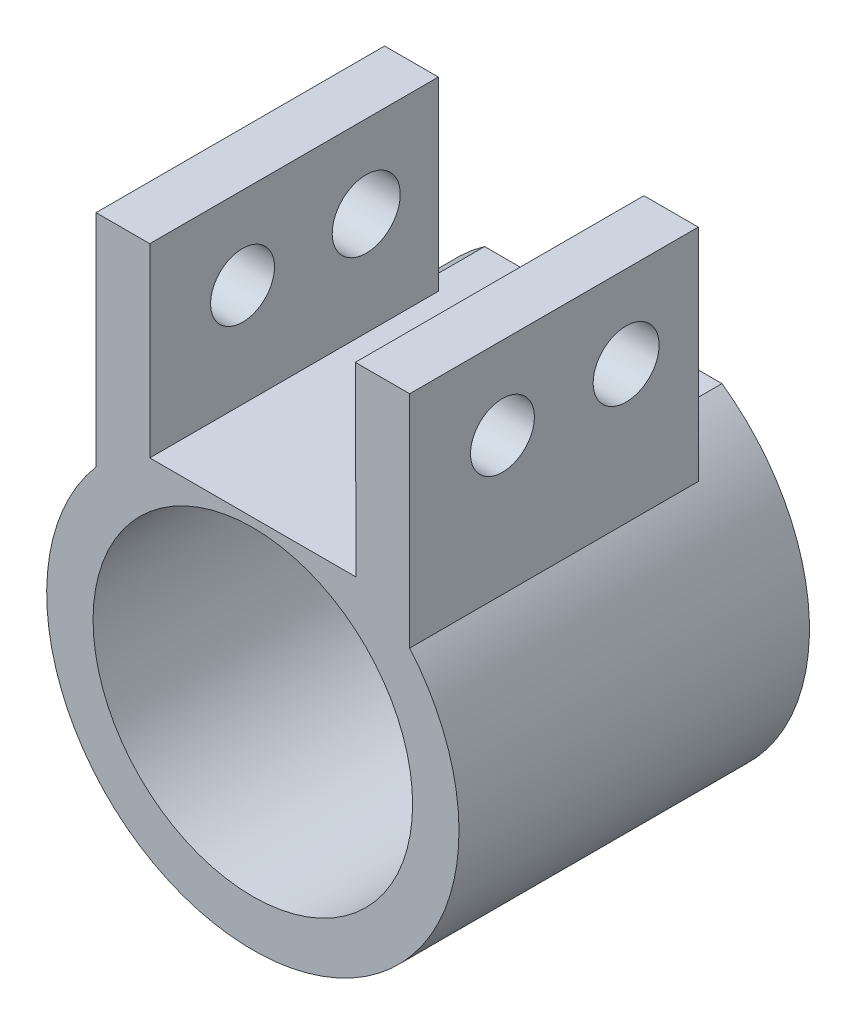
ISO-10303-21;
HEADER;
FILE_DESCRIPTION(('STEP AP214'),'2;1');
FILE_NAME('part.step','',(''),(''),'','','');
FILE_SCHEMA(('AUTOMOTIVE_DESIGN { 1 0 10303 214 1 1 1 1 }'));
ENDSEC;
DATA;
#1=APPLICATION_CONTEXT('core data for automotive mechanical design processes');
#2=APPLICATION_PROTOCOL_DEFINITION('international standard','automotive_design',2000,#1);
#3=PRODUCT_CONTEXT('',#1,'mechanical');
#4=PRODUCT('Part','Part','',(#3));
#5=PRODUCT_RELATED_PRODUCT_CATEGORY('part','',(#4));
#6=PRODUCT_DEFINITION_FORMATION('','',#4);
#7=PRODUCT_DEFINITION_CONTEXT('part definition',#1,'design');
#8=PRODUCT_DEFINITION('design','',#6,#7);
#9=PRODUCT_DEFINITION_SHAPE('','',#8);
#10=(LENGTH_UNIT() NAMED_UNIT(*) SI_UNIT(.MILLI.,.METRE.));
#11=(NAMED_UNIT(*) PLANE_ANGLE_UNIT() SI_UNIT($,.RADIAN.));
#12=(NAMED_UNIT(*) SI_UNIT($,.STERADIAN.) SOLID_ANGLE_UNIT());
#13=UNCERTAINTY_MEASURE_WITH_UNIT(LENGTH_MEASURE(1.E-05),#10,'distance_accuracy_value','');
#14=(GEOMETRIC_REPRESENTATION_CONTEXT(3) GLOBAL_UNCERTAINTY_ASSIGNED_CONTEXT((#13)) GLOBAL_UNIT_ASSIGNED_CONTEXT((#10,
#11,#12)) REPRESENTATION_CONTEXT('',''));
#15=CARTESIAN_POINT('',(0.,0.,0.));
#16=DIRECTION('',(0.,0.,1.));
#17=DIRECTION('',(1.,0.,0.));
#18=AXIS2_PLACEMENT_3D('',#15,#16,#17);
#19=CARTESIAN_POINT('',(0.,12.1763366953853,0.));
#20=DIRECTION('',(0.,1.,0.));
#21=DIRECTION('',(0.,0.,1.));
#22=AXIS2_PLACEMENT_3D('',#19,#20,#21);
#23=PLANE('',#22);
#24=DIRECTION('',(0.,0.,1.));
#25=VECTOR('',#24,1.);
#26=CARTESIAN_POINT('',(4.96946555503048,12.1763366953853,3.));
#27=LINE('',#26,#25);
#28=CARTESIAN_POINT('',(4.96946555503048,12.1763366953853,13.6842719282327));
#29=VERTEX_POINT('',#28);
#30=CARTESIAN_POINT('',(4.96946555503048,12.1763366953853,17.));
#31=VERTEX_POINT('',#30);
#32=EDGE_CURVE('E184',#29,#31,#27,.T.);
#33=ORIENTED_EDGE('',*,*,#32,.F.);
#34=DIRECTION('',(1.,0.,0.));
#35=VECTOR('',#34,1.);
#36=CARTESIAN_POINT('',(-9.39232609008902,12.1763366953853,13.6842719282327));
#37=LINE('',#36,#35);
#38=CARTESIAN_POINT('',(5.,12.1763366953853,13.6842719282327));
#39=VERTEX_POINT('',#38);
#40=EDGE_CURVE('E65',#29,#39,#37,.T.);
#41=ORIENTED_EDGE('',*,*,#40,.T.);
#42=DIRECTION('',(0.,0.,1.));
#43=VECTOR('',#42,1.);
#44=CARTESIAN_POINT('',(5.,12.1763366953853,-2.));
#45=LINE('',#44,#43);
#46=CARTESIAN_POINT('',(5.,12.1763366953853,17.));
#47=VERTEX_POINT('',#46);
#48=EDGE_CURVE('E208',#39,#47,#45,.T.);
#49=ORIENTED_EDGE('',*,*,#48,.T.);
#50=DIRECTION('',(1.,0.,0.));
#51=VECTOR('',#50,1.);
#52=CARTESIAN_POINT('',(4.96946555503048,12.1763366953853,17.));
#53=LINE('',#52,#51);
#54=EDGE_CURVE('E309',#31,#47,#53,.T.);
#55=ORIENTED_EDGE('',*,*,#54,.F.);
#56=EDGE_LOOP('',(#33,#41,#49,#55));
#57=FACE_BOUND('',#56,.T.);
#58=ADVANCED_FACE('F49',(#57),#23,.F.);
#59=DIRECTION('',(-1.,0.,0.));
#60=VECTOR('',#59,1.);
#61=CARTESIAN_POINT('',(19.,12.1763366953853,5.25100040032032));
#62=LINE('',#61,#60);
#63=CARTESIAN_POINT('',(4.96946555503048,12.1763366953853,5.25100040032032));
#64=VERTEX_POINT('',#63);
#65=CARTESIAN_POINT('',(5.,12.1763366953853,5.25100040032032));
#66=VERTEX_POINT('',#65);
#67=EDGE_CURVE('E276',#64,#66,#62,.F.);
#68=ORIENTED_EDGE('',*,*,#67,.F.);
#69=CARTESIAN_POINT('',(4.96946555503048,12.1763366953853,3.));
#70=VERTEX_POINT('',#69);
#71=EDGE_CURVE('E183',#70,#64,#27,.T.);
#72=ORIENTED_EDGE('',*,*,#71,.F.);
#73=DIRECTION('',(-1.,0.,0.));
#74=VECTOR('',#73,1.);
#75=CARTESIAN_POINT('',(4.96946555503048,12.1763366953853,3.));
#76=LINE('',#75,#74);
#77=CARTESIAN_POINT('',(5.,12.1763366953853,3.));
#78=VERTEX_POINT('',#77);
#79=EDGE_CURVE('E186',#78,#70,#76,.T.);
#80=ORIENTED_EDGE('',*,*,#79,.F.);
#81=EDGE_CURVE('E204',#78,#66,#45,.T.);
#82=ORIENTED_EDGE('',*,*,#81,.T.);
#83=EDGE_LOOP('',(#68,#72,#80,#82));
#84=FACE_BOUND('',#83,.T.);
#85=ADVANCED_FACE('F400',(#84),#23,.F.);
#86=CARTESIAN_POINT('',(5.,12.1763366953853,7.74899959967968));
#87=VERTEX_POINT('',#86);
#88=CARTESIAN_POINT('',(5.,12.1763366953853,11.3157280717673));
#89=VERTEX_POINT('',#88);
#90=EDGE_CURVE('E177',#87,#89,#45,.T.);
#91=ORIENTED_EDGE('',*,*,#90,.T.);
#92=DIRECTION('',(1.,0.,0.));
#93=VECTOR('',#92,1.);
#94=CARTESIAN_POINT('',(-9.39232609008902,12.1763366953853,11.3157280717673));
#95=LINE('',#94,#93);
#96=CARTESIAN_POINT('',(4.96946555503048,12.1763366953853,11.3157280717673));
#97=VERTEX_POINT('',#96);
#98=EDGE_CURVE('E164',#89,#97,#95,.F.);
#99=ORIENTED_EDGE('',*,*,#98,.T.);
#100=CARTESIAN_POINT('',(4.96946555503048,12.1763366953853,7.74899959967968));
#101=VERTEX_POINT('',#100);
#102=EDGE_CURVE('E175',#101,#97,#27,.T.);
#103=ORIENTED_EDGE('',*,*,#102,.F.);
#104=DIRECTION('',(-1.,0.,0.));
#105=VECTOR('',#104,1.);
#106=CARTESIAN_POINT('',(19.,12.1763366953853,7.74899959967968));
#107=LINE('',#106,#105);
#108=EDGE_CURVE('E274',#87,#101,#107,.T.);
#109=ORIENTED_EDGE('',*,*,#108,.F.);
#110=EDGE_LOOP('',(#91,#99,#103,#109));
#111=FACE_BOUND('',#110,.T.);
#112=ADVANCED_FACE('F173',(#111),#23,.F.);
#113=CARTESIAN_POINT('',(0.,0.,3.));
#114=DIRECTION('',(0.,0.,-1.));
#115=DIRECTION('',(-1.,0.,0.));
#116=AXIS2_PLACEMENT_3D('',#113,#114,#115);
#117=PLANE('',#116);
#118=CARTESIAN_POINT('',(0.,0.,3.));
#119=DIRECTION('',(0.,0.,-1.));
#120=DIRECTION('',(-1.,0.,0.));
#121=AXIS2_PLACEMENT_3D('',#118,#119,#120);
#122=CIRCLE('',#121,10.);
#123=CARTESIAN_POINT('',(5.75738814426261,8.17633669538531,3.));
#124=VERTEX_POINT('',#123);
#125=CARTESIAN_POINT('',(7.60767390991097,6.49024634975128,3.));
#126=VERTEX_POINT('',#125);
#127=EDGE_CURVE('E264',#124,#126,#122,.T.);
#128=ORIENTED_EDGE('',*,*,#127,.F.);
#129=DIRECTION('',(-1.,0.,0.));
#130=VECTOR('',#129,1.);
#131=CARTESIAN_POINT('',(9.34676632854125,8.17633669538531,3.));
#132=LINE('',#131,#130);
#133=CARTESIAN_POINT('',(5.,8.17633669538531,3.));
#134=VERTEX_POINT('',#133);
#135=EDGE_CURVE('E266',#124,#134,#132,.T.);
#136=ORIENTED_EDGE('',*,*,#135,.T.);
#137=DIRECTION('',(0.,-1.,0.));
#138=VECTOR('',#137,1.);
#139=CARTESIAN_POINT('',(5.00000000000001,0.,3.));
#140=LINE('',#139,#138);
#141=EDGE_CURVE('E233',#78,#134,#140,.T.);
#142=ORIENTED_EDGE('',*,*,#141,.F.);
#143=ORIENTED_EDGE('',*,*,#79,.T.);
#144=DIRECTION('',(0.,-1.,0.));
#145=VECTOR('',#144,1.);
#146=CARTESIAN_POINT('',(4.96946555503048,17.1763366953853,3.));
#147=LINE('',#146,#145);
#148=CARTESIAN_POINT('',(4.96946555503048,17.1763366953853,3.));
#149=VERTEX_POINT('',#148);
#150=EDGE_CURVE('E194',#149,#70,#147,.T.);
#151=ORIENTED_EDGE('',*,*,#150,.F.);
#152=DIRECTION('',(-1.,0.,0.));
#153=VECTOR('',#152,1.);
#154=CARTESIAN_POINT('',(4.96946555503048,17.1763366953853,3.));
#155=LINE('',#154,#153);
#156=CARTESIAN_POINT('',(7.60767390991098,17.1763366953853,3.));
#157=VERTEX_POINT('',#156);
#158=EDGE_CURVE('E190',#157,#149,#155,.T.);
#159=ORIENTED_EDGE('',*,*,#158,.F.);
#160=DIRECTION('',(0.,1.,0.));
#161=VECTOR('',#160,1.);
#162=CARTESIAN_POINT('',(7.60767390991098,5.17633669538531,3.));
#163=LINE('',#162,#161);
#164=EDGE_CURVE('E285',#126,#157,#163,.T.);
#165=ORIENTED_EDGE('',*,*,#164,.F.);
#166=EDGE_LOOP('',(#128,#136,#142,#143,#151,#159,#165));
#167=FACE_BOUND('',#166,.T.);
#168=ADVANCED_FACE('F299',(#167),#117,.T.);
#169=CARTESIAN_POINT('',(0.,0.,1.));
#170=DIRECTION('',(0.,0.,1.));
#171=DIRECTION('',(1.,0.,0.));
#172=AXIS2_PLACEMENT_3D('',#169,#170,#171);
#173=PLANE('',#172);
#174=CARTESIAN_POINT('',(0.,0.,1.));
#175=DIRECTION('',(0.,0.,1.));
#176=DIRECTION('',(1.,0.,0.));
#177=AXIS2_PLACEMENT_3D('',#174,#175,#176);
#178=CIRCLE('',#177,3.5);
#179=CARTESIAN_POINT('',(3.5,0.,1.));
#180=VERTEX_POINT('',#179);
#181=EDGE_CURVE('E216',#180,#180,#178,.T.);
#182=ORIENTED_EDGE('',*,*,#181,.F.);
#183=EDGE_LOOP('',(#182));
#184=FACE_BOUND('',#183,.T.);
#185=CARTESIAN_POINT('',(-5.5,0.,1.));
#186=DIRECTION('',(0.,0.,1.));
#187=DIRECTION('',(1.,0.,0.));
#188=AXIS2_PLACEMENT_3D('',#185,#186,#187);
#189=CIRCLE('',#188,1.1);
#190=CARTESIAN_POINT('',(-4.4,0.,1.));
#191=VERTEX_POINT('',#190);
#192=EDGE_CURVE('E224',#191,#191,#189,.T.);
#193=ORIENTED_EDGE('',*,*,#192,.F.);
#194=EDGE_LOOP('',(#193));
#195=FACE_BOUND('',#194,.T.);
#196=CARTESIAN_POINT('',(5.5,0.,1.));
#197=DIRECTION('',(0.,0.,1.));
#198=DIRECTION('',(1.,0.,0.));
#199=AXIS2_PLACEMENT_3D('',#196,#197,#198);
#200=CIRCLE('',#199,1.1);
#201=CARTESIAN_POINT('',(6.6,0.,1.));
#202=VERTEX_POINT('',#201);
#203=EDGE_CURVE('E219',#202,#202,#200,.T.);
#204=ORIENTED_EDGE('',*,*,#203,.F.);
#205=EDGE_LOOP('',(#204));
#206=FACE_BOUND('',#205,.T.);
#207=CARTESIAN_POINT('',(0.,0.,1.));
#208=DIRECTION('',(0.,0.,1.));
#209=DIRECTION('',(1.,0.,0.));
#210=AXIS2_PLACEMENT_3D('',#207,#208,#209);
#211=CIRCLE('',#210,7.75);
#212=CARTESIAN_POINT('',(7.75,0.,1.));
#213=VERTEX_POINT('',#212);
#214=EDGE_CURVE('E244',#213,#213,#211,.T.);
#215=ORIENTED_EDGE('',*,*,#214,.T.);
#216=EDGE_LOOP('',(#215));
#217=FACE_BOUND('',#216,.T.);
#218=ADVANCED_FACE('F411',(#184,#195,#206,#217),#173,.T.);
#219=CARTESIAN_POINT('',(0.,0.,0.));
#220=DIRECTION('',(0.,0.,1.));
#221=DIRECTION('',(1.,0.,0.));
#222=AXIS2_PLACEMENT_3D('',#219,#220,#221);
#223=PLANE('',#222);
#224=CARTESIAN_POINT('',(0.,0.,0.));
#225=DIRECTION('',(0.,0.,1.));
#226=DIRECTION('',(1.,0.,0.));
#227=AXIS2_PLACEMENT_3D('',#224,#225,#226);
#228=CIRCLE('',#227,10.);
#229=CARTESIAN_POINT('',(-5.75738814426261,8.17633669538531,0.));
#230=VERTEX_POINT('',#229);
#231=CARTESIAN_POINT('',(5.75738814426261,8.17633669538531,0.));
#232=VERTEX_POINT('',#231);
#233=EDGE_CURVE('E261',#230,#232,#228,.T.);
#234=ORIENTED_EDGE('',*,*,#233,.F.);
#235=DIRECTION('',(1.,0.,0.));
#236=VECTOR('',#235,1.);
#237=CARTESIAN_POINT('',(0.,8.17633669538531,0.));
#238=LINE('',#237,#236);
#239=EDGE_CURVE('E207',#230,#232,#238,.T.);
#240=ORIENTED_EDGE('',*,*,#239,.T.);
#241=EDGE_LOOP('',(#234,#240));
#242=FACE_BOUND('',#241,.T.);
#243=CARTESIAN_POINT('',(5.5,0.,0.));
#244=DIRECTION('',(0.,0.,1.));
#245=DIRECTION('',(1.,0.,0.));
#246=AXIS2_PLACEMENT_3D('',#243,#244,#245);
#247=CIRCLE('',#246,1.1);
#248=CARTESIAN_POINT('',(6.6,0.,0.));
#249=VERTEX_POINT('',#248);
#250=EDGE_CURVE('E227',#249,#249,#247,.T.);
#251=ORIENTED_EDGE('',*,*,#250,.T.);
#252=EDGE_LOOP('',(#251));
#253=FACE_BOUND('',#252,.T.);
#254=CARTESIAN_POINT('',(-5.5,0.,0.));
#255=DIRECTION('',(0.,0.,1.));
#256=DIRECTION('',(1.,0.,0.));
#257=AXIS2_PLACEMENT_3D('',#254,#255,#256);
#258=CIRCLE('',#257,1.1);
#259=CARTESIAN_POINT('',(-4.4,0.,0.));
#260=VERTEX_POINT('',#259);
#261=EDGE_CURVE('E220',#260,#260,#258,.T.);
#262=ORIENTED_EDGE('',*,*,#261,.T.);
#263=EDGE_LOOP('',(#262));
#264=FACE_BOUND('',#263,.T.);
#265=CARTESIAN_POINT('',(0.,0.,0.));
#266=DIRECTION('',(0.,0.,-1.));
#267=DIRECTION('',(-1.,0.,0.));
#268=AXIS2_PLACEMENT_3D('',#265,#266,#267);
#269=CIRCLE('',#268,3.5);
#270=CARTESIAN_POINT('',(-3.5,0.,0.));
#271=VERTEX_POINT('',#270);
#272=EDGE_CURVE('E213',#271,#271,#269,.T.);
#273=ORIENTED_EDGE('',*,*,#272,.F.);
#274=EDGE_LOOP('',(#273));
#275=FACE_BOUND('',#274,.T.);
#276=ADVANCED_FACE('F51',(#242,#253,#264,#275),#223,.F.);
#277=CARTESIAN_POINT('',(5.5,0.,0.));
#278=DIRECTION('',(0.,0.,1.));
#279=DIRECTION('',(1.,0.,0.));
#280=AXIS2_PLACEMENT_3D('',#277,#278,#279);
#281=CYLINDRICAL_SURFACE('',#280,1.1);
#282=ORIENTED_EDGE('',*,*,#250,.F.);
#283=EDGE_LOOP('',(#282));
#284=FACE_BOUND('',#283,.T.);
#285=ORIENTED_EDGE('',*,*,#203,.T.);
#286=EDGE_LOOP('',(#285));
#287=FACE_BOUND('',#286,.T.);
#288=ADVANCED_FACE('F428',(#284,#287),#281,.F.);
#289=CARTESIAN_POINT('',(-5.5,0.,0.));
#290=DIRECTION('',(0.,0.,1.));
#291=DIRECTION('',(1.,0.,0.));
#292=AXIS2_PLACEMENT_3D('',#289,#290,#291);
#293=CYLINDRICAL_SURFACE('',#292,1.1);
#294=ORIENTED_EDGE('',*,*,#261,.F.);
#295=EDGE_LOOP('',(#294));
#296=FACE_BOUND('',#295,.T.);
#297=ORIENTED_EDGE('',*,*,#192,.T.);
#298=EDGE_LOOP('',(#297));
#299=FACE_BOUND('',#298,.T.);
#300=ADVANCED_FACE('F423',(#296,#299),#293,.F.);
#301=CARTESIAN_POINT('',(0.,0.,4.));
#302=DIRECTION('',(0.,0.,-1.));
#303=DIRECTION('',(-1.,0.,0.));
#304=AXIS2_PLACEMENT_3D('',#301,#302,#303);
#305=CYLINDRICAL_SURFACE('',#304,3.5);
#306=ORIENTED_EDGE('',*,*,#181,.T.);
#307=EDGE_LOOP('',(#306));
#308=FACE_BOUND('',#307,.T.);
#309=ORIENTED_EDGE('',*,*,#272,.T.);
#310=EDGE_LOOP('',(#309));
#311=FACE_BOUND('',#310,.T.);
#312=ADVANCED_FACE('F419',(#308,#311),#305,.F.);
#313=DIRECTION('',(0.,1.,0.));
#314=VECTOR('',#313,1.);
#315=CARTESIAN_POINT('',(-7.60767390991098,5.17633669538531,3.));
#316=LINE('',#315,#314);
#317=CARTESIAN_POINT('',(-7.60767390991098,6.49024634975128,3.));
#318=VERTEX_POINT('',#317);
#319=CARTESIAN_POINT('',(-7.60767390991098,17.1763366953853,3.));
#320=VERTEX_POINT('',#319);
#321=EDGE_CURVE('E187',#318,#320,#316,.T.);
#322=ORIENTED_EDGE('',*,*,#321,.T.);
#323=DIRECTION('',(-1.,0.,0.));
#324=VECTOR('',#323,1.);
#325=CARTESIAN_POINT('',(-10.,17.1763366953853,3.));
#326=LINE('',#325,#324);
#327=CARTESIAN_POINT('',(-5.,17.1763366953853,3.));
#328=VERTEX_POINT('',#327);
#329=EDGE_CURVE('E200',#328,#320,#326,.T.);
#330=ORIENTED_EDGE('',*,*,#329,.F.);
#331=DIRECTION('',(0.,1.,0.));
#332=VECTOR('',#331,1.);
#333=CARTESIAN_POINT('',(-5.,0.,3.));
#334=LINE('',#333,#332);
#335=CARTESIAN_POINT('',(-5.,8.17633669538531,3.));
#336=VERTEX_POINT('',#335);
#337=EDGE_CURVE('E223',#336,#328,#334,.T.);
#338=ORIENTED_EDGE('',*,*,#337,.F.);
#339=CARTESIAN_POINT('',(-5.75738814426261,8.17633669538531,3.));
#340=VERTEX_POINT('',#339);
#341=EDGE_CURVE('E73',#336,#340,#132,.T.);
#342=ORIENTED_EDGE('',*,*,#341,.T.);
#343=CARTESIAN_POINT('',(0.,0.,3.));
#344=DIRECTION('',(0.,0.,-1.));
#345=DIRECTION('',(-1.,0.,0.));
#346=AXIS2_PLACEMENT_3D('',#343,#344,#345);
#347=CIRCLE('',#346,10.);
#348=EDGE_CURVE('E255',#318,#340,#347,.T.);
#349=ORIENTED_EDGE('',*,*,#348,.F.);
#350=EDGE_LOOP('',(#322,#330,#338,#342,#349));
#351=FACE_BOUND('',#350,.T.);
#352=ADVANCED_FACE('F375',(#351),#117,.T.);
#353=CARTESIAN_POINT('',(-5.,12.1763366953853,-2.));
#354=DIRECTION('',(-1.,0.,0.));
#355=DIRECTION('',(0.,-1.,0.));
#356=AXIS2_PLACEMENT_3D('',#353,#354,#355);
#357=PLANE('',#356);
#358=CARTESIAN_POINT('',(-5.,13.1763366953853,12.5));
#359=DIRECTION('',(-1.,0.,0.));
#360=DIRECTION('',(0.,-1.,0.));
#361=AXIS2_PLACEMENT_3D('',#358,#359,#360);
#362=CIRCLE('',#361,1.55);
#363=CARTESIAN_POINT('',(-5.,11.6263366953853,12.5));
#364=VERTEX_POINT('',#363);
#365=EDGE_CURVE('E315',#364,#364,#362,.T.);
#366=ORIENTED_EDGE('',*,*,#365,.T.);
#367=EDGE_LOOP('',(#366));
#368=FACE_BOUND('',#367,.T.);
#369=CARTESIAN_POINT('',(-5.,13.1763366953853,6.5));
#370=DIRECTION('',(1.,0.,0.));
#371=DIRECTION('',(0.,1.,0.));
#372=AXIS2_PLACEMENT_3D('',#369,#370,#371);
#373=CIRCLE('',#372,1.65);
#374=CARTESIAN_POINT('',(-5.,14.8263366953853,6.5));
#375=VERTEX_POINT('',#374);
#376=EDGE_CURVE('E240',#375,#375,#373,.T.);
#377=ORIENTED_EDGE('',*,*,#376,.F.);
#378=EDGE_LOOP('',(#377));
#379=FACE_BOUND('',#378,.T.);
#380=DIRECTION('',(0.,0.,1.));
#381=VECTOR('',#380,1.);
#382=CARTESIAN_POINT('',(-5.,8.17633669538531,-2.));
#383=LINE('',#382,#381);
#384=CARTESIAN_POINT('',(-5.,8.17633669538531,17.));
#385=VERTEX_POINT('',#384);
#386=EDGE_CURVE('E203',#336,#385,#383,.T.);
#387=ORIENTED_EDGE('',*,*,#386,.F.);
#388=ORIENTED_EDGE('',*,*,#337,.T.);
#389=DIRECTION('',(0.,0.,-1.));
#390=VECTOR('',#389,1.);
#391=CARTESIAN_POINT('',(-5.,17.1763366953853,3.));
#392=LINE('',#391,#390);
#393=CARTESIAN_POINT('',(-5.,17.1763366953853,17.));
#394=VERTEX_POINT('',#393);
#395=EDGE_CURVE('E197',#394,#328,#392,.T.);
#396=ORIENTED_EDGE('',*,*,#395,.F.);
#397=DIRECTION('',(0.,1.,0.));
#398=VECTOR('',#397,1.);
#399=CARTESIAN_POINT('',(-5.,8.17633669538531,17.));
#400=LINE('',#399,#398);
#401=EDGE_CURVE('E324',#385,#394,#400,.T.);
#402=ORIENTED_EDGE('',*,*,#401,.F.);
#403=EDGE_LOOP('',(#387,#388,#396,#402));
#404=FACE_BOUND('',#403,.T.);
#405=ADVANCED_FACE('F372',(#368,#379,#404),#357,.F.);
#406=CARTESIAN_POINT('',(5.,12.1763366953853,-2.));
#407=DIRECTION('',(1.,0.,0.));
#408=DIRECTION('',(0.,1.,0.));
#409=AXIS2_PLACEMENT_3D('',#406,#407,#408);
#410=PLANE('',#409);
#411=ORIENTED_EDGE('',*,*,#48,.F.);
#412=CARTESIAN_POINT('',(5.,13.1763366953853,12.5));
#413=DIRECTION('',(1.,0.,0.));
#414=DIRECTION('',(0.,1.,0.));
#415=AXIS2_PLACEMENT_3D('',#412,#413,#414);
#416=CIRCLE('',#415,1.55);
#417=EDGE_CURVE('E350',#39,#89,#416,.T.);
#418=ORIENTED_EDGE('',*,*,#417,.T.);
#419=ORIENTED_EDGE('',*,*,#90,.F.);
#420=CARTESIAN_POINT('',(5.,13.1763366953853,6.5));
#421=DIRECTION('',(1.,0.,0.));
#422=DIRECTION('',(0.,1.,0.));
#423=AXIS2_PLACEMENT_3D('',#420,#421,#422);
#424=CIRCLE('',#423,1.6);
#425=EDGE_CURVE('E278',#66,#87,#424,.F.);
#426=ORIENTED_EDGE('',*,*,#425,.F.);
#427=ORIENTED_EDGE('',*,*,#81,.F.);
#428=ORIENTED_EDGE('',*,*,#141,.T.);
#429=DIRECTION('',(0.,0.,1.));
#430=VECTOR('',#429,1.);
#431=CARTESIAN_POINT('',(5.,8.17633669538531,-2.));
#432=LINE('',#431,#430);
#433=CARTESIAN_POINT('',(5.,8.17633669538531,17.));
#434=VERTEX_POINT('',#433);
#435=EDGE_CURVE('E209',#134,#434,#432,.T.);
#436=ORIENTED_EDGE('',*,*,#435,.T.);
#437=DIRECTION('',(0.,-1.,0.));
#438=VECTOR('',#437,1.);
#439=CARTESIAN_POINT('',(5.,12.1763366953853,17.));
#440=LINE('',#439,#438);
#441=EDGE_CURVE('E312',#47,#434,#440,.T.);
#442=ORIENTED_EDGE('',*,*,#441,.F.);
#443=EDGE_LOOP('',(#411,#418,#419,#426,#427,#428,#436,#442));
#444=FACE_BOUND('',#443,.T.);
#445=ADVANCED_FACE('F345',(#444),#410,.F.);
#446=CARTESIAN_POINT('',(-5.,8.17633669538531,-2.));
#447=DIRECTION('',(0.,-1.,0.));
#448=DIRECTION('',(0.,0.,-1.));
#449=AXIS2_PLACEMENT_3D('',#446,#447,#448);
#450=PLANE('',#449);
#451=ORIENTED_EDGE('',*,*,#435,.F.);
#452=ORIENTED_EDGE('',*,*,#135,.F.);
#453=DIRECTION('',(0.,0.,1.));
#454=VECTOR('',#453,1.);
#455=CARTESIAN_POINT('',(5.75738814426261,8.17633669538531,0.));
#456=LINE('',#455,#454);
#457=EDGE_CURVE('E13',#124,#232,#456,.F.);
#458=ORIENTED_EDGE('',*,*,#457,.T.);
#459=ORIENTED_EDGE('',*,*,#239,.F.);
#460=DIRECTION('',(0.,0.,1.));
#461=VECTOR('',#460,1.);
#462=CARTESIAN_POINT('',(-5.75738814426261,8.17633669538531,0.));
#463=LINE('',#462,#461);
#464=EDGE_CURVE('E58',#230,#340,#463,.T.);
#465=ORIENTED_EDGE('',*,*,#464,.T.);
#466=ORIENTED_EDGE('',*,*,#341,.F.);
#467=ORIENTED_EDGE('',*,*,#386,.T.);
#468=DIRECTION('',(-1.,0.,0.));
#469=VECTOR('',#468,1.);
#470=CARTESIAN_POINT('',(5.,8.17633669538531,17.));
#471=LINE('',#470,#469);
#472=EDGE_CURVE('E321',#434,#385,#471,.T.);
#473=ORIENTED_EDGE('',*,*,#472,.F.);
#474=EDGE_LOOP('',(#451,#452,#458,#459,#465,#466,#467,#473));
#475=FACE_BOUND('',#474,.T.);
#476=ADVANCED_FACE('F250',(#475),#450,.F.);
#477=CARTESIAN_POINT('',(0.,17.1763366953853,0.));
#478=DIRECTION('',(0.,1.,0.));
#479=DIRECTION('',(0.,0.,1.));
#480=AXIS2_PLACEMENT_3D('',#477,#478,#479);
#481=PLANE('',#480);
#482=DIRECTION('',(0.,0.,-1.));
#483=VECTOR('',#482,1.);
#484=CARTESIAN_POINT('',(-7.60767390991098,17.1763366953853,3.));
#485=LINE('',#484,#483);
#486=CARTESIAN_POINT('',(-7.60767390991098,17.1763366953853,17.));
#487=VERTEX_POINT('',#486);
#488=EDGE_CURVE('E282',#487,#320,#485,.T.);
#489=ORIENTED_EDGE('',*,*,#488,.F.);
#490=DIRECTION('',(-1.,0.,0.));
#491=VECTOR('',#490,1.);
#492=CARTESIAN_POINT('',(-5.,17.1763366953853,17.));
#493=LINE('',#492,#491);
#494=EDGE_CURVE('E327',#394,#487,#493,.T.);
#495=ORIENTED_EDGE('',*,*,#494,.F.);
#496=ORIENTED_EDGE('',*,*,#395,.T.);
#497=ORIENTED_EDGE('',*,*,#329,.T.);
#498=EDGE_LOOP('',(#489,#495,#496,#497));
#499=FACE_BOUND('',#498,.T.);
#500=ADVANCED_FACE('F382',(#499),#481,.T.);
#501=CARTESIAN_POINT('',(4.96946555503048,17.1763366953853,3.));
#502=DIRECTION('',(1.,0.,0.));
#503=DIRECTION('',(0.,0.,-1.));
#504=AXIS2_PLACEMENT_3D('',#501,#502,#503);
#505=PLANE('',#504);
#506=ORIENTED_EDGE('',*,*,#102,.T.);
#507=CARTESIAN_POINT('',(4.96946555503048,13.1763366953853,12.5));
#508=DIRECTION('',(1.,0.,0.));
#509=DIRECTION('',(0.,0.,-1.));
#510=AXIS2_PLACEMENT_3D('',#507,#508,#509);
#511=CIRCLE('',#510,1.55);
#512=EDGE_CURVE('E161',#97,#29,#511,.T.);
#513=ORIENTED_EDGE('',*,*,#512,.T.);
#514=ORIENTED_EDGE('',*,*,#32,.T.);
#515=DIRECTION('',(0.,-1.,0.));
#516=VECTOR('',#515,1.);
#517=CARTESIAN_POINT('',(4.96946555503048,17.1763366953853,17.));
#518=LINE('',#517,#516);
#519=CARTESIAN_POINT('',(4.96946555503048,17.1763366953853,17.));
#520=VERTEX_POINT('',#519);
#521=EDGE_CURVE('E305',#520,#31,#518,.T.);
#522=ORIENTED_EDGE('',*,*,#521,.F.);
#523=DIRECTION('',(0.,0.,1.));
#524=VECTOR('',#523,1.);
#525=CARTESIAN_POINT('',(4.96946555503048,17.1763366953853,3.));
#526=LINE('',#525,#524);
#527=EDGE_CURVE('E193',#149,#520,#526,.T.);
#528=ORIENTED_EDGE('',*,*,#527,.F.);
#529=ORIENTED_EDGE('',*,*,#150,.T.);
#530=ORIENTED_EDGE('',*,*,#71,.T.);
#531=CARTESIAN_POINT('',(4.96946555503048,13.1763366953853,6.5));
#532=DIRECTION('',(1.,0.,0.));
#533=DIRECTION('',(0.,0.,-1.));
#534=AXIS2_PLACEMENT_3D('',#531,#532,#533);
#535=CIRCLE('',#534,1.6);
#536=EDGE_CURVE('E182',#101,#64,#535,.F.);
#537=ORIENTED_EDGE('',*,*,#536,.F.);
#538=EDGE_LOOP('',(#506,#513,#514,#522,#528,#529,#530,#537));
#539=FACE_BOUND('',#538,.T.);
#540=ADVANCED_FACE('F180',(#539),#505,.F.);
#541=CARTESIAN_POINT('',(0.,17.1763366953853,0.));
#542=DIRECTION('',(0.,1.,0.));
#543=DIRECTION('',(0.,0.,1.));
#544=AXIS2_PLACEMENT_3D('',#541,#542,#543);
#545=PLANE('',#544);
#546=DIRECTION('',(0.,0.,1.));
#547=VECTOR('',#546,1.);
#548=CARTESIAN_POINT('',(7.60767390991098,17.1763366953853,3.));
#549=LINE('',#548,#547);
#550=CARTESIAN_POINT('',(7.60767390991098,17.1763366953853,17.));
#551=VERTEX_POINT('',#550);
#552=EDGE_CURVE('E239',#157,#551,#549,.T.);
#553=ORIENTED_EDGE('',*,*,#552,.F.);
#554=ORIENTED_EDGE('',*,*,#158,.T.);
#555=ORIENTED_EDGE('',*,*,#527,.T.);
#556=DIRECTION('',(-1.,0.,0.));
#557=VECTOR('',#556,1.);
#558=CARTESIAN_POINT('',(7.60767390991098,17.1763366953853,17.));
#559=LINE('',#558,#557);
#560=EDGE_CURVE('E339',#551,#520,#559,.T.);
#561=ORIENTED_EDGE('',*,*,#560,.F.);
#562=EDGE_LOOP('',(#553,#554,#555,#561));
#563=FACE_BOUND('',#562,.T.);
#564=ADVANCED_FACE('F295',(#563),#545,.T.);
#565=CARTESIAN_POINT('',(7.60767390991098,5.17633669538531,3.));
#566=DIRECTION('',(-1.,0.,0.));
#567=DIRECTION('',(0.,0.,1.));
#568=AXIS2_PLACEMENT_3D('',#565,#566,#567);
#569=PLANE('',#568);
#570=CARTESIAN_POINT('',(7.60767390991098,13.1763366953853,12.5));
#571=DIRECTION('',(1.,0.,0.));
#572=DIRECTION('',(0.,0.,-1.));
#573=AXIS2_PLACEMENT_3D('',#570,#571,#572);
#574=CIRCLE('',#573,1.55);
#575=CARTESIAN_POINT('',(7.60767390991098,13.1763366953853,10.95));
#576=VERTEX_POINT('',#575);
#577=EDGE_CURVE('E356',#576,#576,#574,.T.);
#578=ORIENTED_EDGE('',*,*,#577,.F.);
#579=EDGE_LOOP('',(#578));
#580=FACE_BOUND('',#579,.T.);
#581=CARTESIAN_POINT('',(7.60767390991098,13.1763366953853,6.5));
#582=DIRECTION('',(-1.,0.,0.));
#583=DIRECTION('',(0.,0.,1.));
#584=AXIS2_PLACEMENT_3D('',#581,#582,#583);
#585=CIRCLE('',#584,1.6);
#586=CARTESIAN_POINT('',(7.60767390991098,13.1763366953853,8.1));
#587=VERTEX_POINT('',#586);
#588=EDGE_CURVE('E241',#587,#587,#585,.F.);
#589=ORIENTED_EDGE('',*,*,#588,.F.);
#590=EDGE_LOOP('',(#589));
#591=FACE_BOUND('',#590,.T.);
#592=ORIENTED_EDGE('',*,*,#552,.T.);
#593=DIRECTION('',(0.,1.,0.));
#594=VECTOR('',#593,1.);
#595=CARTESIAN_POINT('',(7.60767390991098,6.49024634975128,17.));
#596=LINE('',#595,#594);
#597=CARTESIAN_POINT('',(7.60767390991098,6.49024634975128,17.));
#598=VERTEX_POINT('',#597);
#599=EDGE_CURVE('E336',#598,#551,#596,.T.);
#600=ORIENTED_EDGE('',*,*,#599,.F.);
#601=DIRECTION('',(0.,0.,1.));
#602=VECTOR('',#601,1.);
#603=CARTESIAN_POINT('',(7.60767390991097,6.49024634975128,0.));
#604=LINE('',#603,#602);
#605=EDGE_CURVE('E260',#598,#126,#604,.F.);
#606=ORIENTED_EDGE('',*,*,#605,.T.);
#607=ORIENTED_EDGE('',*,*,#164,.T.);
#608=EDGE_LOOP('',(#592,#600,#606,#607));
#609=FACE_BOUND('',#608,.T.);
#610=ADVANCED_FACE('F387',(#580,#591,#609),#569,.F.);
#611=CARTESIAN_POINT('',(-7.60767390991098,5.17633669538531,3.));
#612=DIRECTION('',(1.,0.,0.));
#613=DIRECTION('',(0.,0.,-1.));
#614=AXIS2_PLACEMENT_3D('',#611,#612,#613);
#615=PLANE('',#614);
#616=CARTESIAN_POINT('',(-7.60767390991098,13.1763366953853,12.5));
#617=DIRECTION('',(1.,0.,0.));
#618=DIRECTION('',(0.,0.,-1.));
#619=AXIS2_PLACEMENT_3D('',#616,#617,#618);
#620=CIRCLE('',#619,1.55);
#621=CARTESIAN_POINT('',(-7.60767390991098,13.1763366953853,10.95));
#622=VERTEX_POINT('',#621);
#623=EDGE_CURVE('E53',#622,#622,#620,.T.);
#624=ORIENTED_EDGE('',*,*,#623,.T.);
#625=EDGE_LOOP('',(#624));
#626=FACE_BOUND('',#625,.T.);
#627=CARTESIAN_POINT('',(-7.60767390991098,13.1763366953853,6.5));
#628=DIRECTION('',(1.,0.,0.));
#629=DIRECTION('',(0.,0.,-1.));
#630=AXIS2_PLACEMENT_3D('',#627,#628,#629);
#631=CIRCLE('',#630,1.65);
#632=CARTESIAN_POINT('',(-7.60767390991098,13.1763366953853,4.85));
#633=VERTEX_POINT('',#632);
#634=EDGE_CURVE('E236',#633,#633,#631,.T.);
#635=ORIENTED_EDGE('',*,*,#634,.T.);
#636=EDGE_LOOP('',(#635));
#637=FACE_BOUND('',#636,.T.);
#638=ORIENTED_EDGE('',*,*,#321,.F.);
#639=DIRECTION('',(0.,0.,1.));
#640=VECTOR('',#639,1.);
#641=CARTESIAN_POINT('',(-7.60767390991098,6.49024634975128,0.));
#642=LINE('',#641,#640);
#643=CARTESIAN_POINT('',(-7.60767390991098,6.49024634975128,17.));
#644=VERTEX_POINT('',#643);
#645=EDGE_CURVE('E235',#318,#644,#642,.T.);
#646=ORIENTED_EDGE('',*,*,#645,.T.);
#647=DIRECTION('',(0.,-1.,0.));
#648=VECTOR('',#647,1.);
#649=CARTESIAN_POINT('',(-7.60767390991098,17.1763366953853,17.));
#650=LINE('',#649,#648);
#651=EDGE_CURVE('E330',#487,#644,#650,.T.);
#652=ORIENTED_EDGE('',*,*,#651,.F.);
#653=ORIENTED_EDGE('',*,*,#488,.T.);
#654=EDGE_LOOP('',(#638,#646,#652,#653));
#655=FACE_BOUND('',#654,.T.);
#656=ADVANCED_FACE('F363',(#626,#637,#655),#615,.F.);
#657=CARTESIAN_POINT('',(-15.,13.1763366953853,6.5));
#658=DIRECTION('',(1.,0.,0.));
#659=DIRECTION('',(0.,1.,0.));
#660=AXIS2_PLACEMENT_3D('',#657,#658,#659);
#661=CYLINDRICAL_SURFACE('',#660,1.65);
#662=ORIENTED_EDGE('',*,*,#376,.T.);
#663=EDGE_LOOP('',(#662));
#664=FACE_BOUND('',#663,.T.);
#665=ORIENTED_EDGE('',*,*,#634,.F.);
#666=EDGE_LOOP('',(#665));
#667=FACE_BOUND('',#666,.T.);
#668=ADVANCED_FACE('F395',(#664,#667),#661,.F.);
#669=CARTESIAN_POINT('',(19.,13.1763366953853,6.5));
#670=DIRECTION('',(-1.,0.,0.));
#671=DIRECTION('',(0.,-1.,0.));
#672=AXIS2_PLACEMENT_3D('',#669,#670,#671);
#673=CYLINDRICAL_SURFACE('',#672,1.6);
#674=ORIENTED_EDGE('',*,*,#588,.T.);
#675=EDGE_LOOP('',(#674));
#676=FACE_BOUND('',#675,.T.);
#677=ORIENTED_EDGE('',*,*,#425,.T.);
#678=ORIENTED_EDGE('',*,*,#108,.T.);
#679=ORIENTED_EDGE('',*,*,#536,.T.);
#680=ORIENTED_EDGE('',*,*,#67,.T.);
#681=EDGE_LOOP('',(#677,#678,#679,#680));
#682=FACE_BOUND('',#681,.T.);
#683=ADVANCED_FACE('F449',(#676,#682),#673,.F.);
#684=CARTESIAN_POINT('',(0.,0.,1.));
#685=DIRECTION('',(0.,0.,1.));
#686=DIRECTION('',(1.,0.,0.));
#687=AXIS2_PLACEMENT_3D('',#684,#685,#686);
#688=CYLINDRICAL_SURFACE('',#687,7.75);
#689=ORIENTED_EDGE('',*,*,#214,.F.);
#690=EDGE_LOOP('',(#689));
#691=FACE_BOUND('',#690,.T.);
#692=CARTESIAN_POINT('',(0.,0.,17.));
#693=DIRECTION('',(0.,0.,1.));
#694=DIRECTION('',(1.,0.,0.));
#695=AXIS2_PLACEMENT_3D('',#692,#693,#694);
#696=CIRCLE('',#695,7.75);
#697=CARTESIAN_POINT('',(7.75,0.,17.));
#698=VERTEX_POINT('',#697);
#699=EDGE_CURVE('E310',#698,#698,#696,.T.);
#700=ORIENTED_EDGE('',*,*,#699,.T.);
#701=EDGE_LOOP('',(#700));
#702=FACE_BOUND('',#701,.T.);
#703=ADVANCED_FACE('F446',(#691,#702),#688,.F.);
#704=CARTESIAN_POINT('',(0.,0.,0.));
#705=DIRECTION('',(0.,0.,1.));
#706=DIRECTION('',(1.,0.,0.));
#707=AXIS2_PLACEMENT_3D('',#704,#705,#706);
#708=CYLINDRICAL_SURFACE('',#707,10.);
#709=ORIENTED_EDGE('',*,*,#457,.F.);
#710=ORIENTED_EDGE('',*,*,#127,.T.);
#711=ORIENTED_EDGE('',*,*,#605,.F.);
#712=CARTESIAN_POINT('',(0.,0.,17.));
#713=DIRECTION('',(0.,0.,1.));
#714=DIRECTION('',(1.,0.,0.));
#715=AXIS2_PLACEMENT_3D('',#712,#713,#714);
#716=CIRCLE('',#715,10.);
#717=EDGE_CURVE('E333',#644,#598,#716,.T.);
#718=ORIENTED_EDGE('',*,*,#717,.F.);
#719=ORIENTED_EDGE('',*,*,#645,.F.);
#720=ORIENTED_EDGE('',*,*,#348,.T.);
#721=ORIENTED_EDGE('',*,*,#464,.F.);
#722=ORIENTED_EDGE('',*,*,#233,.T.);
#723=EDGE_LOOP('',(#709,#710,#711,#718,#719,#720,#721,#722));
#724=FACE_BOUND('',#723,.T.);
#725=ADVANCED_FACE('F257',(#724),#708,.T.);
#726=CARTESIAN_POINT('',(0.,0.,17.));
#727=DIRECTION('',(0.,0.,1.));
#728=DIRECTION('',(1.,0.,0.));
#729=AXIS2_PLACEMENT_3D('',#726,#727,#728);
#730=PLANE('',#729);
#731=ORIENTED_EDGE('',*,*,#521,.T.);
#732=ORIENTED_EDGE('',*,*,#54,.T.);
#733=ORIENTED_EDGE('',*,*,#441,.T.);
#734=ORIENTED_EDGE('',*,*,#472,.T.);
#735=ORIENTED_EDGE('',*,*,#401,.T.);
#736=ORIENTED_EDGE('',*,*,#494,.T.);
#737=ORIENTED_EDGE('',*,*,#651,.T.);
#738=ORIENTED_EDGE('',*,*,#717,.T.);
#739=ORIENTED_EDGE('',*,*,#599,.T.);
#740=ORIENTED_EDGE('',*,*,#560,.T.);
#741=EDGE_LOOP('',(#731,#732,#733,#734,#735,#736,#737,#738,#739,#740));
#742=FACE_BOUND('',#741,.T.);
#743=ORIENTED_EDGE('',*,*,#699,.F.);
#744=EDGE_LOOP('',(#743));
#745=FACE_BOUND('',#744,.T.);
#746=ADVANCED_FACE('F346',(#742,#745),#730,.T.);
#747=CARTESIAN_POINT('',(-9.39232609008902,13.1763366953853,12.5));
#748=DIRECTION('',(1.,0.,0.));
#749=DIRECTION('',(0.,0.,-1.));
#750=AXIS2_PLACEMENT_3D('',#747,#748,#749);
#751=CYLINDRICAL_SURFACE('',#750,1.55);
#752=ORIENTED_EDGE('',*,*,#623,.F.);
#753=EDGE_LOOP('',(#752));
#754=FACE_BOUND('',#753,.T.);
#755=ORIENTED_EDGE('',*,*,#365,.F.);
#756=EDGE_LOOP('',(#755));
#757=FACE_BOUND('',#756,.T.);
#758=ADVANCED_FACE('F366',(#754,#757),#751,.F.);
#759=ORIENTED_EDGE('',*,*,#577,.T.);
#760=EDGE_LOOP('',(#759));
#761=FACE_BOUND('',#760,.T.);
#762=ORIENTED_EDGE('',*,*,#40,.F.);
#763=ORIENTED_EDGE('',*,*,#512,.F.);
#764=ORIENTED_EDGE('',*,*,#98,.F.);
#765=ORIENTED_EDGE('',*,*,#417,.F.);
#766=EDGE_LOOP('',(#762,#763,#764,#765));
#767=FACE_BOUND('',#766,.T.);
#768=ADVANCED_FACE('F163',(#761,#767),#751,.F.);
#769=CLOSED_SHELL('',(#58,#85,#112,#168,#218,#276,#288,#300,#312,#352,#405,#445,#476,#500,#540,
#564,#610,#656,#668,#683,#703,#725,#746,#758,#768));
#770=MANIFOLD_SOLID_BREP('B2',#769);
#771=ADVANCED_BREP_SHAPE_REPRESENTATION('',(#18,#770),#14);
#772=SHAPE_DEFINITION_REPRESENTATION(#9,#771);
ENDSEC;
END-ISO-10303-21;
